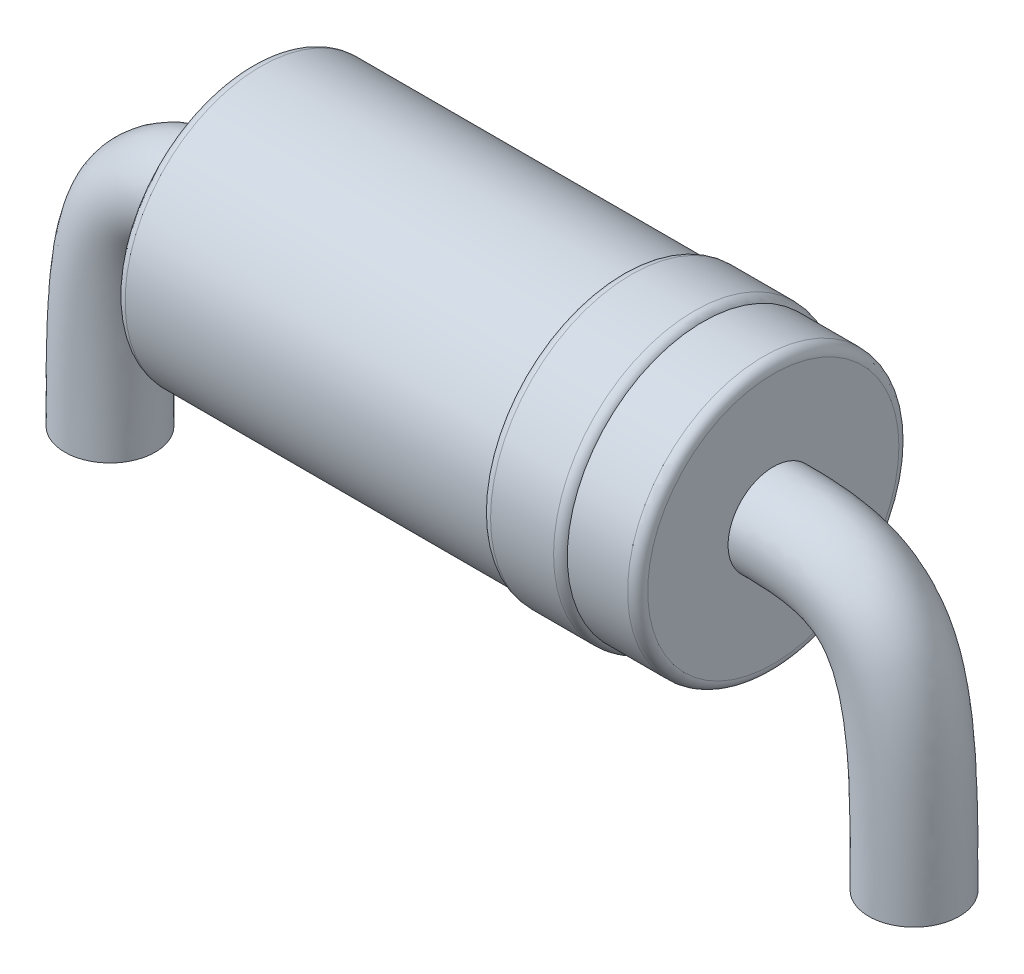
ISO-10303-21;
HEADER;
FILE_DESCRIPTION(('STEP AP214'),'2;1');
FILE_NAME('part.step','',(''),(''),'','','');
FILE_SCHEMA(('AUTOMOTIVE_DESIGN { 1 0 10303 214 1 1 1 1 }'));
ENDSEC;
DATA;
#1=APPLICATION_CONTEXT('core data for automotive mechanical design processes');
#2=APPLICATION_PROTOCOL_DEFINITION('international standard','automotive_design',2000,#1);
#3=PRODUCT_CONTEXT('',#1,'mechanical');
#4=PRODUCT('Part','Part','',(#3));
#5=PRODUCT_RELATED_PRODUCT_CATEGORY('part','',(#4));
#6=PRODUCT_DEFINITION_FORMATION('','',#4);
#7=PRODUCT_DEFINITION_CONTEXT('part definition',#1,'design');
#8=PRODUCT_DEFINITION('design','',#6,#7);
#9=PRODUCT_DEFINITION_SHAPE('','',#8);
#10=(LENGTH_UNIT() NAMED_UNIT(*) SI_UNIT(.MILLI.,.METRE.));
#11=(NAMED_UNIT(*) PLANE_ANGLE_UNIT() SI_UNIT($,.RADIAN.));
#12=(NAMED_UNIT(*) SI_UNIT($,.STERADIAN.) SOLID_ANGLE_UNIT());
#13=UNCERTAINTY_MEASURE_WITH_UNIT(LENGTH_MEASURE(1.E-05),#10,'distance_accuracy_value','');
#14=(GEOMETRIC_REPRESENTATION_CONTEXT(3) GLOBAL_UNCERTAINTY_ASSIGNED_CONTEXT((#13)) GLOBAL_UNIT_ASSIGNED_CONTEXT((#10,
#11,#12)) REPRESENTATION_CONTEXT('',''));
#15=CARTESIAN_POINT('',(0.,0.,0.));
#16=DIRECTION('',(0.,0.,1.));
#17=DIRECTION('',(1.,0.,0.));
#18=AXIS2_PLACEMENT_3D('',#15,#16,#17);
#19=CARTESIAN_POINT('',(2.6,2.,0.));
#20=DIRECTION('',(1.,0.,0.));
#21=DIRECTION('',(0.,0.,-1.));
#22=AXIS2_PLACEMENT_3D('',#19,#20,#21);
#23=PLANE('',#22);
#24=CARTESIAN_POINT('',(2.6,2.,0.));
#25=DIRECTION('',(1.,0.,0.));
#26=DIRECTION('',(0.,0.,-1.));
#27=AXIS2_PLACEMENT_3D('',#24,#25,#26);
#28=CIRCLE('',#27,0.45);
#29=CARTESIAN_POINT('',(2.6,2.,-0.45));
#30=VERTEX_POINT('',#29);
#31=EDGE_CURVE('E53',#30,#30,#28,.T.);
#32=ORIENTED_EDGE('',*,*,#31,.F.);
#33=EDGE_LOOP('',(#32));
#34=FACE_BOUND('',#33,.T.);
#35=ADVANCED_FACE('F46',(#34),#23,.F.);
#36=CARTESIAN_POINT('',(4.,-0.5,0.));
#37=DIRECTION('',(0.,-1.,0.));
#38=DIRECTION('',(0.,0.,-1.));
#39=AXIS2_PLACEMENT_3D('',#36,#37,#38);
#40=PLANE('',#39);
#41=CARTESIAN_POINT('',(4.,-0.5,0.));
#42=DIRECTION('',(0.,-1.,0.));
#43=DIRECTION('',(0.,0.,-1.));
#44=AXIS2_PLACEMENT_3D('',#41,#42,#43);
#45=CIRCLE('',#44,0.45);
#46=CARTESIAN_POINT('',(4.,-0.5,-0.45));
#47=VERTEX_POINT('',#46);
#48=EDGE_CURVE('E12',#47,#47,#45,.T.);
#49=ORIENTED_EDGE('',*,*,#48,.T.);
#50=EDGE_LOOP('',(#49));
#51=FACE_BOUND('',#50,.T.);
#52=ADVANCED_FACE('F60',(#51),#40,.T.);
#53=CARTESIAN_POINT('',(2.6,2.,-0.45));
#54=CARTESIAN_POINT('',(2.77194795608265,2.00000017738285,-0.45));
#55=CARTESIAN_POINT('',(3.04375046607114,1.99837468413619,-0.45));
#56=CARTESIAN_POINT('',(3.50078078392885,1.85025812836381,-0.45));
#57=CARTESIAN_POINT('',(3.68541379866437,1.70052280986357,-0.45));
#58=CARTESIAN_POINT('',(3.91458620133563,1.20572719013643,-0.45));
#59=CARTESIAN_POINT('',(3.96379998629481,0.857420897671951,-0.45));
#60=CARTESIAN_POINT('',(4.00416876370519,0.110352539828049,-0.45));
#61=CARTESIAN_POINT('',(4.00000004625385,-0.286301219527369,-0.45));
#62=CARTESIAN_POINT('',(4.,-0.5,-0.45));
#63=CARTESIAN_POINT('',(2.6,2.9,-0.45));
#64=CARTESIAN_POINT('',(2.77762834977364,2.90000019489964,-0.45));
#65=CARTESIAN_POINT('',(3.12196050027418,2.91911427900673,-0.45));
#66=CARTESIAN_POINT('',(3.97749146527272,2.64184531289518,-0.45));
#67=CARTESIAN_POINT('',(4.40668487416929,2.28471011075183,-0.45));
#68=CARTESIAN_POINT('',(4.82663415358902,1.37802449157835,-0.45));
#69=CARTESIAN_POINT('',(4.86006925691067,0.950755909198259,-0.45));
#70=CARTESIAN_POINT('',(4.90527786612876,0.114130782444187,-0.45));
#71=CARTESIAN_POINT('',(4.900000035092,-0.297999397958433,-0.45));
#72=CARTESIAN_POINT('',(4.9,-0.499999999999995,-0.45));
#73=CARTESIAN_POINT('',(2.6,2.9,0.45));
#74=CARTESIAN_POINT('',(2.77762834977364,2.90000019489964,0.45));
#75=CARTESIAN_POINT('',(3.12196050027418,2.91911427900673,0.45));
#76=CARTESIAN_POINT('',(3.97749146527272,2.64184531289518,0.45));
#77=CARTESIAN_POINT('',(4.40668487416929,2.28471011075183,0.45));
#78=CARTESIAN_POINT('',(4.82663415358902,1.37802449157835,0.45));
#79=CARTESIAN_POINT('',(4.86006925691067,0.950755909198259,0.45));
#80=CARTESIAN_POINT('',(4.90527786612876,0.114130782444187,0.45));
#81=CARTESIAN_POINT('',(4.900000035092,-0.297999397958433,0.45));
#82=CARTESIAN_POINT('',(4.9,-0.499999999999995,0.45));
#83=CARTESIAN_POINT('',(2.6,2.,0.45));
#84=CARTESIAN_POINT('',(2.77194795608265,2.00000017738285,0.45));
#85=CARTESIAN_POINT('',(3.04375046607114,1.99837468413619,0.45));
#86=CARTESIAN_POINT('',(3.50078078392885,1.85025812836381,0.45));
#87=CARTESIAN_POINT('',(3.68541379866437,1.70052280986357,0.45));
#88=CARTESIAN_POINT('',(3.91458620133563,1.20572719013643,0.45));
#89=CARTESIAN_POINT('',(3.96379998629481,0.857420897671951,0.45));
#90=CARTESIAN_POINT('',(4.00416876370519,0.110352539828049,0.45));
#91=CARTESIAN_POINT('',(4.00000004625385,-0.286301219527369,0.45));
#92=CARTESIAN_POINT('',(4.,-0.5,0.45));
#93=CARTESIAN_POINT('',(2.6,1.1,0.45));
#94=CARTESIAN_POINT('',(2.76626756239166,1.10000015986605,0.45));
#95=CARTESIAN_POINT('',(2.96554043186811,1.07763508926566,0.45));
#96=CARTESIAN_POINT('',(3.02407010258499,1.05867094383244,0.45));
#97=CARTESIAN_POINT('',(2.96414272315946,1.11633550897532,0.45));
#98=CARTESIAN_POINT('',(3.00253824908223,1.03342988869451,0.45));
#99=CARTESIAN_POINT('',(3.06753071567895,0.764085886145643,0.45));
#100=CARTESIAN_POINT('',(3.10305966128163,0.106574297211911,0.45));
#101=CARTESIAN_POINT('',(3.1000000574157,-0.274603041096304,0.45));
#102=CARTESIAN_POINT('',(3.1,-0.500000000000004,0.45));
#103=CARTESIAN_POINT('',(2.6,1.1,-0.45));
#104=CARTESIAN_POINT('',(2.76626756239166,1.10000015986605,-0.45));
#105=CARTESIAN_POINT('',(2.96554043186811,1.07763508926566,-0.45));
#106=CARTESIAN_POINT('',(3.02407010258499,1.05867094383244,-0.45));
#107=CARTESIAN_POINT('',(2.96414272315946,1.11633550897532,-0.45));
#108=CARTESIAN_POINT('',(3.00253824908223,1.03342988869451,-0.45));
#109=CARTESIAN_POINT('',(3.06753071567895,0.764085886145643,-0.45));
#110=CARTESIAN_POINT('',(3.10305966128163,0.106574297211911,-0.45));
#111=CARTESIAN_POINT('',(3.1000000574157,-0.274603041096304,-0.45));
#112=CARTESIAN_POINT('',(3.1,-0.500000000000004,-0.45));
#113=CARTESIAN_POINT('',(2.6,2.,-0.45));
#114=CARTESIAN_POINT('',(2.77194795608265,2.00000017738285,-0.45));
#115=CARTESIAN_POINT('',(3.04375046607114,1.99837468413619,-0.45));
#116=CARTESIAN_POINT('',(3.50078078392885,1.85025812836381,-0.45));
#117=CARTESIAN_POINT('',(3.68541379866437,1.70052280986357,-0.45));
#118=CARTESIAN_POINT('',(3.91458620133563,1.20572719013643,-0.45));
#119=CARTESIAN_POINT('',(3.96379998629481,0.857420897671951,-0.45));
#120=CARTESIAN_POINT('',(4.00416876370519,0.110352539828049,-0.45));
#121=CARTESIAN_POINT('',(4.00000004625385,-0.286301219527369,-0.45));
#122=CARTESIAN_POINT('',(4.,-0.5,-0.45));
#123=(BOUNDED_SURFACE() B_SPLINE_SURFACE(3,3,((#53,#54,#55,#56,#57,#58,#59,#60,#61,#62),(#63,
#64,#65,#66,#67,#68,#69,#70,#71,#72),(#73,#74,#75,#76,#77,#78,#79,#80,#81,#82),(#83,#84,#85,#86,
#87,#88,#89,#90,#91,#92),(#93,#94,#95,#96,#97,#98,#99,#100,#101,#102),(#103,#104,#105,#106,#107,
#108,#109,#110,#111,#112),(#113,#114,#115,#116,#117,#118,#119,#120,#121,#122)),.UNSPECIFIED.,
.T.,.F.,.F.) B_SPLINE_SURFACE_WITH_KNOTS((4,3,4),(4,2,2,2,4),(0.,0.5,1.),(0.,0.25,0.5,0.75,1.),
.UNSPECIFIED.) GEOMETRIC_REPRESENTATION_ITEM() RATIONAL_B_SPLINE_SURFACE(((1.,1.,1.,1.,1.,1.,1.,
1.,1.,1.),(0.333333333333333,0.333333333333333,0.333333333333333,0.333333333333333,
0.333333333333333,0.333333333333333,0.333333333333333,0.333333333333333,0.333333333333333,
0.333333333333333),(0.333333333333333,0.333333333333333,0.333333333333333,0.333333333333333,
0.333333333333333,0.333333333333333,0.333333333333333,0.333333333333333,0.333333333333333,
0.333333333333333),(1.,1.,1.,1.,1.,1.,1.,1.,1.,1.),(0.333333333333333,0.333333333333333,
0.333333333333333,0.333333333333333,0.333333333333333,0.333333333333333,0.333333333333333,
0.333333333333333,0.333333333333333,0.333333333333333),(0.333333333333333,0.333333333333333,
0.333333333333333,0.333333333333333,0.333333333333333,0.333333333333333,0.333333333333333,
0.333333333333333,0.333333333333333,0.333333333333333),(1.,1.,1.,1.,1.,1.,1.,1.,1.,1.))) REPRESENTATION_ITEM('') SURFACE());
#124=ORIENTED_EDGE('',*,*,#48,.F.);
#125=EDGE_LOOP('',(#124));
#126=FACE_BOUND('',#125,.T.);
#127=ORIENTED_EDGE('',*,*,#31,.T.);
#128=EDGE_LOOP('',(#127));
#129=FACE_BOUND('',#128,.T.);
#130=ADVANCED_FACE('F62',(#126,#129),#123,.T.);
#131=CLOSED_SHELL('',(#35,#52,#130));
#132=MANIFOLD_SOLID_BREP('B2',#131);
#133=CARTESIAN_POINT('',(-2.6,2.,0.));
#134=DIRECTION('',(-1.,0.,0.));
#135=DIRECTION('',(0.,0.,1.));
#136=AXIS2_PLACEMENT_3D('',#133,#134,#135);
#137=PLANE('',#136);
#138=CARTESIAN_POINT('',(-2.6,2.,0.));
#139=DIRECTION('',(-1.,0.,0.));
#140=DIRECTION('',(0.,0.,1.));
#141=AXIS2_PLACEMENT_3D('',#138,#139,#140);
#142=CIRCLE('',#141,0.45);
#143=CARTESIAN_POINT('',(-2.6,2.,0.45));
#144=VERTEX_POINT('',#143);
#145=EDGE_CURVE('E110',#144,#144,#142,.T.);
#146=ORIENTED_EDGE('',*,*,#145,.F.);
#147=EDGE_LOOP('',(#146));
#148=FACE_BOUND('',#147,.T.);
#149=ADVANCED_FACE('F103',(#148),#137,.F.);
#150=CARTESIAN_POINT('',(-4.,-0.5,0.));
#151=DIRECTION('',(0.,-1.,0.));
#152=DIRECTION('',(0.,0.,1.));
#153=AXIS2_PLACEMENT_3D('',#150,#151,#152);
#154=PLANE('',#153);
#155=CARTESIAN_POINT('',(-4.,-0.5,0.));
#156=DIRECTION('',(0.,-1.,0.));
#157=DIRECTION('',(0.,0.,1.));
#158=AXIS2_PLACEMENT_3D('',#155,#156,#157);
#159=CIRCLE('',#158,0.45);
#160=CARTESIAN_POINT('',(-4.,-0.5,0.45));
#161=VERTEX_POINT('',#160);
#162=EDGE_CURVE('E44',#161,#161,#159,.T.);
#163=ORIENTED_EDGE('',*,*,#162,.T.);
#164=EDGE_LOOP('',(#163));
#165=FACE_BOUND('',#164,.T.);
#166=ADVANCED_FACE('F117',(#165),#154,.T.);
#167=CARTESIAN_POINT('',(-2.6,2.,0.45));
#168=CARTESIAN_POINT('',(-2.77194795608265,2.00000017738285,0.45));
#169=CARTESIAN_POINT('',(-3.04375046607114,1.99837468413619,0.45));
#170=CARTESIAN_POINT('',(-3.50078078392885,1.85025812836381,0.45));
#171=CARTESIAN_POINT('',(-3.68541379866437,1.70052280986357,0.45));
#172=CARTESIAN_POINT('',(-3.91458620133563,1.20572719013643,0.45));
#173=CARTESIAN_POINT('',(-3.96379998629481,0.857420897671951,0.45));
#174=CARTESIAN_POINT('',(-4.00416876370519,0.110352539828049,0.45));
#175=CARTESIAN_POINT('',(-4.00000004625385,-0.286301219527369,0.45));
#176=CARTESIAN_POINT('',(-4.,-0.5,0.45));
#177=CARTESIAN_POINT('',(-2.6,2.9,0.45));
#178=CARTESIAN_POINT('',(-2.77762834977364,2.90000019489964,0.45));
#179=CARTESIAN_POINT('',(-3.12196050027418,2.91911427900673,0.45));
#180=CARTESIAN_POINT('',(-3.97749146527272,2.64184531289518,0.45));
#181=CARTESIAN_POINT('',(-4.40668487416929,2.28471011075183,0.45));
#182=CARTESIAN_POINT('',(-4.82663415358902,1.37802449157835,0.45));
#183=CARTESIAN_POINT('',(-4.86006925691067,0.950755909198259,0.45));
#184=CARTESIAN_POINT('',(-4.90527786612876,0.114130782444187,0.45));
#185=CARTESIAN_POINT('',(-4.900000035092,-0.297999397958433,0.45));
#186=CARTESIAN_POINT('',(-4.9,-0.499999999999995,0.45));
#187=CARTESIAN_POINT('',(-2.6,2.9,-0.45));
#188=CARTESIAN_POINT('',(-2.77762834977364,2.90000019489964,-0.45));
#189=CARTESIAN_POINT('',(-3.12196050027418,2.91911427900673,-0.45));
#190=CARTESIAN_POINT('',(-3.97749146527272,2.64184531289518,-0.45));
#191=CARTESIAN_POINT('',(-4.40668487416929,2.28471011075183,-0.45));
#192=CARTESIAN_POINT('',(-4.82663415358902,1.37802449157835,-0.45));
#193=CARTESIAN_POINT('',(-4.86006925691067,0.950755909198259,-0.45));
#194=CARTESIAN_POINT('',(-4.90527786612876,0.114130782444187,-0.45));
#195=CARTESIAN_POINT('',(-4.900000035092,-0.297999397958433,-0.45));
#196=CARTESIAN_POINT('',(-4.9,-0.499999999999995,-0.45));
#197=CARTESIAN_POINT('',(-2.6,2.,-0.45));
#198=CARTESIAN_POINT('',(-2.77194795608265,2.00000017738285,-0.45));
#199=CARTESIAN_POINT('',(-3.04375046607114,1.99837468413619,-0.45));
#200=CARTESIAN_POINT('',(-3.50078078392885,1.85025812836381,-0.45));
#201=CARTESIAN_POINT('',(-3.68541379866437,1.70052280986357,-0.45));
#202=CARTESIAN_POINT('',(-3.91458620133563,1.20572719013643,-0.45));
#203=CARTESIAN_POINT('',(-3.96379998629481,0.857420897671951,-0.45));
#204=CARTESIAN_POINT('',(-4.00416876370519,0.110352539828049,-0.45));
#205=CARTESIAN_POINT('',(-4.00000004625385,-0.286301219527369,-0.45));
#206=CARTESIAN_POINT('',(-4.,-0.5,-0.45));
#207=CARTESIAN_POINT('',(-2.6,1.1,-0.45));
#208=CARTESIAN_POINT('',(-2.76626756239166,1.10000015986605,-0.45));
#209=CARTESIAN_POINT('',(-2.96554043186811,1.07763508926566,-0.45));
#210=CARTESIAN_POINT('',(-3.02407010258499,1.05867094383244,-0.45));
#211=CARTESIAN_POINT('',(-2.96414272315946,1.11633550897532,-0.45));
#212=CARTESIAN_POINT('',(-3.00253824908223,1.03342988869451,-0.45));
#213=CARTESIAN_POINT('',(-3.06753071567895,0.764085886145643,-0.45));
#214=CARTESIAN_POINT('',(-3.10305966128163,0.106574297211911,-0.45));
#215=CARTESIAN_POINT('',(-3.1000000574157,-0.274603041096304,-0.45));
#216=CARTESIAN_POINT('',(-3.1,-0.500000000000004,-0.45));
#217=CARTESIAN_POINT('',(-2.6,1.1,0.45));
#218=CARTESIAN_POINT('',(-2.76626756239166,1.10000015986605,0.45));
#219=CARTESIAN_POINT('',(-2.96554043186811,1.07763508926566,0.45));
#220=CARTESIAN_POINT('',(-3.02407010258499,1.05867094383244,0.45));
#221=CARTESIAN_POINT('',(-2.96414272315946,1.11633550897532,0.45));
#222=CARTESIAN_POINT('',(-3.00253824908223,1.03342988869451,0.45));
#223=CARTESIAN_POINT('',(-3.06753071567895,0.764085886145643,0.45));
#224=CARTESIAN_POINT('',(-3.10305966128163,0.106574297211911,0.45));
#225=CARTESIAN_POINT('',(-3.1000000574157,-0.274603041096304,0.45));
#226=CARTESIAN_POINT('',(-3.1,-0.500000000000004,0.45));
#227=CARTESIAN_POINT('',(-2.6,2.,0.45));
#228=CARTESIAN_POINT('',(-2.77194795608265,2.00000017738285,0.45));
#229=CARTESIAN_POINT('',(-3.04375046607114,1.99837468413619,0.45));
#230=CARTESIAN_POINT('',(-3.50078078392885,1.85025812836381,0.45));
#231=CARTESIAN_POINT('',(-3.68541379866437,1.70052280986357,0.45));
#232=CARTESIAN_POINT('',(-3.91458620133563,1.20572719013643,0.45));
#233=CARTESIAN_POINT('',(-3.96379998629481,0.857420897671951,0.45));
#234=CARTESIAN_POINT('',(-4.00416876370519,0.110352539828049,0.45));
#235=CARTESIAN_POINT('',(-4.00000004625385,-0.286301219527369,0.45));
#236=CARTESIAN_POINT('',(-4.,-0.5,0.45));
#237=(BOUNDED_SURFACE() B_SPLINE_SURFACE(3,3,((#167,#168,#169,#170,#171,#172,#173,#174,#175,
#176),(#177,#178,#179,#180,#181,#182,#183,#184,#185,#186),(#187,#188,#189,#190,#191,#192,#193,
#194,#195,#196),(#197,#198,#199,#200,#201,#202,#203,#204,#205,#206),(#207,#208,#209,#210,#211,
#212,#213,#214,#215,#216),(#217,#218,#219,#220,#221,#222,#223,#224,#225,#226),(#227,#228,#229,
#230,#231,#232,#233,#234,#235,#236)),.UNSPECIFIED.,.T.,.F.,.F.) B_SPLINE_SURFACE_WITH_KNOTS((4,
3,4),(4,2,2,2,4),(0.,0.5,1.),(0.,0.25,0.5,0.75,1.),
.UNSPECIFIED.) GEOMETRIC_REPRESENTATION_ITEM() RATIONAL_B_SPLINE_SURFACE(((1.,1.,1.,1.,1.,1.,1.,
1.,1.,1.),(0.333333333333333,0.333333333333333,0.333333333333333,0.333333333333333,
0.333333333333333,0.333333333333333,0.333333333333333,0.333333333333333,0.333333333333333,
0.333333333333333),(0.333333333333333,0.333333333333333,0.333333333333333,0.333333333333333,
0.333333333333333,0.333333333333333,0.333333333333333,0.333333333333333,0.333333333333333,
0.333333333333333),(1.,1.,1.,1.,1.,1.,1.,1.,1.,1.),(0.333333333333333,0.333333333333333,
0.333333333333333,0.333333333333333,0.333333333333333,0.333333333333333,0.333333333333333,
0.333333333333333,0.333333333333333,0.333333333333333),(0.333333333333333,0.333333333333333,
0.333333333333333,0.333333333333333,0.333333333333333,0.333333333333333,0.333333333333333,
0.333333333333333,0.333333333333333,0.333333333333333),(1.,1.,1.,1.,1.,1.,1.,1.,1.,1.))) REPRESENTATION_ITEM('') SURFACE());
#238=ORIENTED_EDGE('',*,*,#162,.F.);
#239=EDGE_LOOP('',(#238));
#240=FACE_BOUND('',#239,.T.);
#241=ORIENTED_EDGE('',*,*,#145,.T.);
#242=EDGE_LOOP('',(#241));
#243=FACE_BOUND('',#242,.T.);
#244=ADVANCED_FACE('F119',(#240,#243),#237,.T.);
#245=CLOSED_SHELL('',(#149,#166,#244));
#246=MANIFOLD_SOLID_BREP('B6',#245);
#247=CARTESIAN_POINT('',(2.6,2.,0.));
#248=DIRECTION('',(-1.,0.,0.));
#249=DIRECTION('',(0.,0.,1.));
#250=AXIS2_PLACEMENT_3D('',#247,#248,#249);
#251=CYLINDRICAL_SURFACE('',#250,1.35);
#252=CARTESIAN_POINT('',(2.5,2.,0.));
#253=DIRECTION('',(1.,0.,0.));
#254=DIRECTION('',(0.,0.,-1.));
#255=AXIS2_PLACEMENT_3D('',#252,#253,#254);
#256=CIRCLE('',#255,1.35);
#257=CARTESIAN_POINT('',(2.5,2.,-1.35));
#258=VERTEX_POINT('',#257);
#259=EDGE_CURVE('E173',#258,#258,#256,.F.);
#260=ORIENTED_EDGE('',*,*,#259,.T.);
#261=EDGE_LOOP('',(#260));
#262=FACE_BOUND('',#261,.T.);
#263=CARTESIAN_POINT('',(1.9,2.,0.));
#264=DIRECTION('',(1.,0.,0.));
#265=DIRECTION('',(0.,0.,-1.));
#266=AXIS2_PLACEMENT_3D('',#263,#264,#265);
#267=CIRCLE('',#266,1.35);
#268=CARTESIAN_POINT('',(1.9,2.,-1.35));
#269=VERTEX_POINT('',#268);
#270=EDGE_CURVE('E182',#269,#269,#267,.T.);
#271=ORIENTED_EDGE('',*,*,#270,.T.);
#272=EDGE_LOOP('',(#271));
#273=FACE_BOUND('',#272,.T.);
#274=ADVANCED_FACE('F153',(#262,#273),#251,.T.);
#275=CARTESIAN_POINT('',(2.6,2.,0.));
#276=DIRECTION('',(1.,0.,0.));
#277=DIRECTION('',(0.,0.,-1.));
#278=AXIS2_PLACEMENT_3D('',#275,#276,#277);
#279=PLANE('',#278);
#280=CARTESIAN_POINT('',(2.6,2.,0.));
#281=DIRECTION('',(1.,0.,0.));
#282=DIRECTION('',(0.,0.,-1.));
#283=AXIS2_PLACEMENT_3D('',#280,#281,#282);
#284=CIRCLE('',#283,1.25);
#285=CARTESIAN_POINT('',(2.6,2.,-1.25));
#286=VERTEX_POINT('',#285);
#287=EDGE_CURVE('E176',#286,#286,#284,.T.);
#288=ORIENTED_EDGE('',*,*,#287,.T.);
#289=EDGE_LOOP('',(#288));
#290=FACE_BOUND('',#289,.T.);
#291=ADVANCED_FACE('F196',(#290),#279,.T.);
#292=CARTESIAN_POINT('',(1.9,2.,0.));
#293=DIRECTION('',(-1.,0.,0.));
#294=DIRECTION('',(0.,0.,1.));
#295=AXIS2_PLACEMENT_3D('',#292,#293,#294);
#296=CYLINDRICAL_SURFACE('',#295,1.4);
#297=CARTESIAN_POINT('',(1.18660254037845,2.,0.));
#298=DIRECTION('',(-1.,0.,0.));
#299=DIRECTION('',(0.,0.,1.));
#300=AXIS2_PLACEMENT_3D('',#297,#298,#299);
#301=CIRCLE('',#300,1.4);
#302=CARTESIAN_POINT('',(1.18660254037845,2.,1.4));
#303=VERTEX_POINT('',#302);
#304=EDGE_CURVE('E102',#303,#303,#301,.F.);
#305=ORIENTED_EDGE('',*,*,#304,.T.);
#306=EDGE_LOOP('',(#305));
#307=FACE_BOUND('',#306,.T.);
#308=CARTESIAN_POINT('',(1.81339745962156,2.,0.));
#309=DIRECTION('',(1.,0.,0.));
#310=DIRECTION('',(0.,0.,-1.));
#311=AXIS2_PLACEMENT_3D('',#308,#309,#310);
#312=CIRCLE('',#311,1.4);
#313=CARTESIAN_POINT('',(1.81339745962156,2.,-1.4));
#314=VERTEX_POINT('',#313);
#315=EDGE_CURVE('E160',#314,#314,#312,.F.);
#316=ORIENTED_EDGE('',*,*,#315,.T.);
#317=EDGE_LOOP('',(#316));
#318=FACE_BOUND('',#317,.T.);
#319=ADVANCED_FACE('F203',(#307,#318),#296,.T.);
#320=CARTESIAN_POINT('',(-2.6,2.,0.));
#321=DIRECTION('',(1.,0.,0.));
#322=DIRECTION('',(0.,0.,-1.));
#323=AXIS2_PLACEMENT_3D('',#320,#321,#322);
#324=PLANE('',#323);
#325=CARTESIAN_POINT('',(-2.6,2.,0.));
#326=DIRECTION('',(1.,0.,0.));
#327=DIRECTION('',(0.,0.,-1.));
#328=AXIS2_PLACEMENT_3D('',#325,#326,#327);
#329=CIRCLE('',#328,1.25);
#330=CARTESIAN_POINT('',(-2.6,2.,-1.25));
#331=VERTEX_POINT('',#330);
#332=EDGE_CURVE('E164',#331,#331,#329,.F.);
#333=ORIENTED_EDGE('',*,*,#332,.T.);
#334=EDGE_LOOP('',(#333));
#335=FACE_BOUND('',#334,.T.);
#336=ADVANCED_FACE('F210',(#335),#324,.F.);
#337=CARTESIAN_POINT('',(-2.5,2.,0.));
#338=DIRECTION('',(1.,0.,0.));
#339=DIRECTION('',(0.,0.,-1.));
#340=AXIS2_PLACEMENT_3D('',#337,#338,#339);
#341=CIRCLE('',#340,1.35);
#342=CARTESIAN_POINT('',(-2.5,2.,-1.35));
#343=VERTEX_POINT('',#342);
#344=EDGE_CURVE('E168',#343,#343,#341,.T.);
#345=ORIENTED_EDGE('',*,*,#344,.T.);
#346=EDGE_LOOP('',(#345));
#347=FACE_BOUND('',#346,.T.);
#348=CARTESIAN_POINT('',(1.1,2.,0.));
#349=DIRECTION('',(1.,0.,0.));
#350=DIRECTION('',(0.,0.,-1.));
#351=AXIS2_PLACEMENT_3D('',#348,#349,#350);
#352=CIRCLE('',#351,1.35);
#353=CARTESIAN_POINT('',(1.1,2.,-1.35));
#354=VERTEX_POINT('',#353);
#355=EDGE_CURVE('E179',#354,#354,#352,.T.);
#356=ORIENTED_EDGE('',*,*,#355,.F.);
#357=EDGE_LOOP('',(#356));
#358=FACE_BOUND('',#357,.T.);
#359=ADVANCED_FACE('F199',(#347,#358),#251,.T.);
#360=CARTESIAN_POINT('',(2.5,2.,0.));
#361=DIRECTION('',(1.,0.,0.));
#362=DIRECTION('',(0.,0.,-1.));
#363=AXIS2_PLACEMENT_3D('',#360,#361,#362);
#364=TOROIDAL_SURFACE('',#363,1.25,0.1);
#365=ORIENTED_EDGE('',*,*,#259,.F.);
#366=EDGE_LOOP('',(#365));
#367=FACE_BOUND('',#366,.T.);
#368=ORIENTED_EDGE('',*,*,#287,.F.);
#369=EDGE_LOOP('',(#368));
#370=FACE_BOUND('',#369,.T.);
#371=ADVANCED_FACE('F209',(#367,#370),#364,.T.);
#372=CARTESIAN_POINT('',(-2.5,2.,0.));
#373=DIRECTION('',(1.,0.,0.));
#374=DIRECTION('',(0.,0.,-1.));
#375=AXIS2_PLACEMENT_3D('',#372,#373,#374);
#376=TOROIDAL_SURFACE('',#375,1.25,0.1);
#377=ORIENTED_EDGE('',*,*,#332,.F.);
#378=EDGE_LOOP('',(#377));
#379=FACE_BOUND('',#378,.T.);
#380=ORIENTED_EDGE('',*,*,#344,.F.);
#381=EDGE_LOOP('',(#380));
#382=FACE_BOUND('',#381,.T.);
#383=ADVANCED_FACE('F193',(#379,#382),#376,.T.);
#384=CARTESIAN_POINT('',(1.18660254037845,2.,0.));
#385=DIRECTION('',(-1.,0.,0.));
#386=DIRECTION('',(0.,0.,1.));
#387=AXIS2_PLACEMENT_3D('',#384,#385,#386);
#388=TOROIDAL_SURFACE('',#387,1.3,0.1);
#389=ORIENTED_EDGE('',*,*,#355,.T.);
#390=EDGE_LOOP('',(#389));
#391=FACE_BOUND('',#390,.T.);
#392=ORIENTED_EDGE('',*,*,#304,.F.);
#393=EDGE_LOOP('',(#392));
#394=FACE_BOUND('',#393,.T.);
#395=ADVANCED_FACE('F188',(#391,#394),#388,.T.);
#396=CARTESIAN_POINT('',(1.81339745962156,2.,0.));
#397=DIRECTION('',(1.,0.,0.));
#398=DIRECTION('',(0.,0.,-1.));
#399=AXIS2_PLACEMENT_3D('',#396,#397,#398);
#400=TOROIDAL_SURFACE('',#399,1.3,0.1);
#401=ORIENTED_EDGE('',*,*,#315,.F.);
#402=EDGE_LOOP('',(#401));
#403=FACE_BOUND('',#402,.T.);
#404=ORIENTED_EDGE('',*,*,#270,.F.);
#405=EDGE_LOOP('',(#404));
#406=FACE_BOUND('',#405,.T.);
#407=ADVANCED_FACE('F155',(#403,#406),#400,.T.);
#408=CLOSED_SHELL('',(#274,#291,#319,#336,#359,#371,#383,#395,#407));
#409=MANIFOLD_SOLID_BREP('B38',#408);
#410=ADVANCED_BREP_SHAPE_REPRESENTATION('',(#18,#132,#246,#409),#14);
#411=SHAPE_DEFINITION_REPRESENTATION(#9,#410);
ENDSEC;
END-ISO-10303-21;
